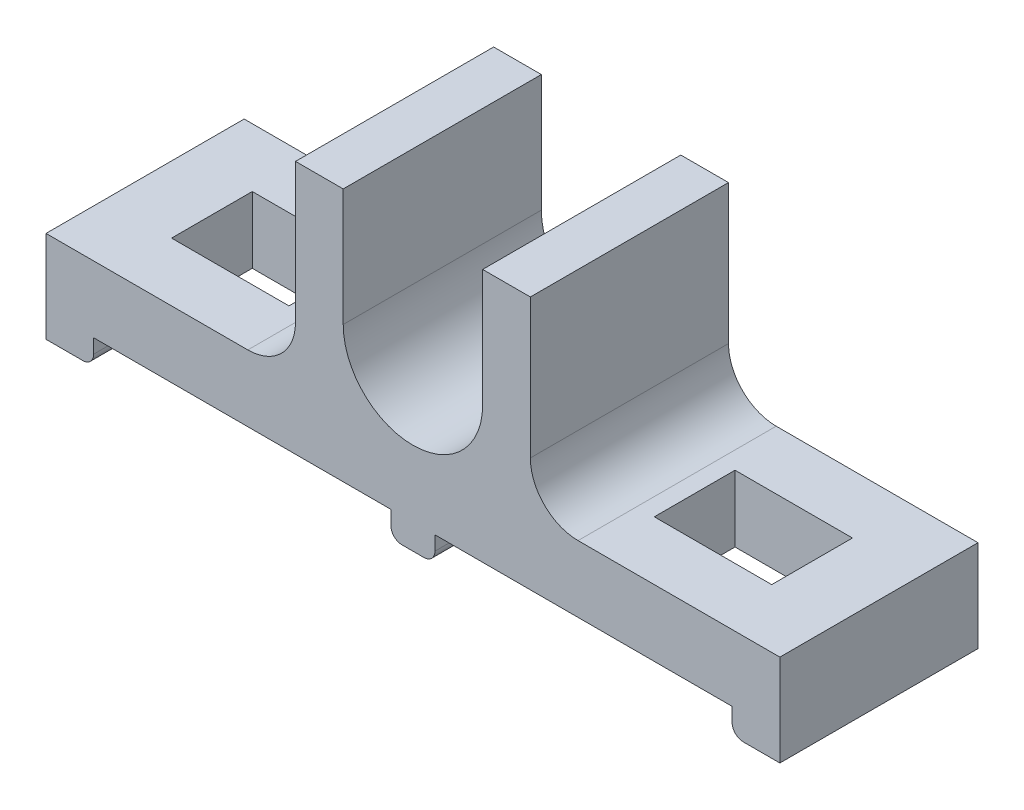
ISO-10303-21;
HEADER;
FILE_DESCRIPTION(('STEP AP214'),'2;1');
FILE_NAME('part.step','',(''),(''),'','','');
FILE_SCHEMA(('AUTOMOTIVE_DESIGN { 1 0 10303 214 1 1 1 1 }'));
ENDSEC;
DATA;
#1=APPLICATION_CONTEXT('core data for automotive mechanical design processes');
#2=APPLICATION_PROTOCOL_DEFINITION('international standard','automotive_design',2000,#1);
#3=PRODUCT_CONTEXT('',#1,'mechanical');
#4=PRODUCT('Part','Part','',(#3));
#5=PRODUCT_RELATED_PRODUCT_CATEGORY('part','',(#4));
#6=PRODUCT_DEFINITION_FORMATION('','',#4);
#7=PRODUCT_DEFINITION_CONTEXT('part definition',#1,'design');
#8=PRODUCT_DEFINITION('design','',#6,#7);
#9=PRODUCT_DEFINITION_SHAPE('','',#8);
#10=(LENGTH_UNIT() NAMED_UNIT(*) SI_UNIT(.MILLI.,.METRE.));
#11=(NAMED_UNIT(*) PLANE_ANGLE_UNIT() SI_UNIT($,.RADIAN.));
#12=(NAMED_UNIT(*) SI_UNIT($,.STERADIAN.) SOLID_ANGLE_UNIT());
#13=UNCERTAINTY_MEASURE_WITH_UNIT(LENGTH_MEASURE(1.E-05),#10,'distance_accuracy_value','');
#14=(GEOMETRIC_REPRESENTATION_CONTEXT(3) GLOBAL_UNCERTAINTY_ASSIGNED_CONTEXT((#13)) GLOBAL_UNIT_ASSIGNED_CONTEXT((#10,
#11,#12)) REPRESENTATION_CONTEXT('',''));
#15=CARTESIAN_POINT('',(0.,0.,0.));
#16=DIRECTION('',(0.,0.,1.));
#17=DIRECTION('',(1.,0.,0.));
#18=AXIS2_PLACEMENT_3D('',#15,#16,#17);
#19=CARTESIAN_POINT('',(187.,6.86757116341439,27.));
#20=DIRECTION('',(0.,1.,0.));
#21=DIRECTION('',(-1.,0.,0.));
#22=AXIS2_PLACEMENT_3D('',#19,#20,#21);
#23=PLANE('',#22);
#24=DIRECTION('',(1.,0.,0.));
#25=VECTOR('',#24,1.);
#26=CARTESIAN_POINT('',(187.,6.86757116341439,-27.));
#27=LINE('',#26,#25);
#28=CARTESIAN_POINT('',(106.,6.86757116341462,-27.));
#29=VERTEX_POINT('',#28);
#30=CARTESIAN_POINT('',(187.,6.86757116341439,-27.));
#31=VERTEX_POINT('',#30);
#32=EDGE_CURVE('E460',#29,#31,#27,.T.);
#33=ORIENTED_EDGE('',*,*,#32,.T.);
#34=DIRECTION('',(0.,0.,-1.));
#35=VECTOR('',#34,1.);
#36=CARTESIAN_POINT('',(187.,6.86757116341439,27.));
#37=LINE('',#36,#35);
#38=CARTESIAN_POINT('',(187.,6.86757116341439,27.));
#39=VERTEX_POINT('',#38);
#40=EDGE_CURVE('E566',#39,#31,#37,.T.);
#41=ORIENTED_EDGE('',*,*,#40,.F.);
#42=DIRECTION('',(1.,0.,0.));
#43=VECTOR('',#42,1.);
#44=CARTESIAN_POINT('',(187.,6.86757116341439,27.));
#45=LINE('',#44,#43);
#46=CARTESIAN_POINT('',(106.,6.86757116341462,27.));
#47=VERTEX_POINT('',#46);
#48=EDGE_CURVE('E381',#47,#39,#45,.T.);
#49=ORIENTED_EDGE('',*,*,#48,.F.);
#50=DIRECTION('',(0.,0.,-1.));
#51=VECTOR('',#50,1.);
#52=CARTESIAN_POINT('',(106.,6.86757116341462,27.));
#53=LINE('',#52,#51);
#54=EDGE_CURVE('E570',#47,#29,#53,.T.);
#55=ORIENTED_EDGE('',*,*,#54,.T.);
#56=EDGE_LOOP('',(#33,#41,#49,#55));
#57=FACE_BOUND('',#56,.T.);
#58=DIRECTION('',(0.,0.,1.));
#59=VECTOR('',#58,1.);
#60=CARTESIAN_POINT('',(181.781960671619,6.8675711634144,27.));
#61=LINE('',#60,#59);
#62=CARTESIAN_POINT('',(181.781960671619,6.86757116341445,-11.));
#63=VERTEX_POINT('',#62);
#64=CARTESIAN_POINT('',(181.781960671619,6.86757116341445,11.));
#65=VERTEX_POINT('',#64);
#66=EDGE_CURVE('E301',#63,#65,#61,.T.);
#67=ORIENTED_EDGE('',*,*,#66,.F.);
#68=DIRECTION('',(1.,0.,0.));
#69=VECTOR('',#68,1.);
#70=CARTESIAN_POINT('',(187.,6.86757116341439,-11.));
#71=LINE('',#70,#69);
#72=CARTESIAN_POINT('',(149.781960671618,6.8675711634145,-11.));
#73=VERTEX_POINT('',#72);
#74=EDGE_CURVE('E289',#73,#63,#71,.T.);
#75=ORIENTED_EDGE('',*,*,#74,.F.);
#76=DIRECTION('',(0.,0.,-1.));
#77=VECTOR('',#76,1.);
#78=CARTESIAN_POINT('',(149.781960671619,6.8675711634145,27.));
#79=LINE('',#78,#77);
#80=CARTESIAN_POINT('',(149.781960671619,6.86757116341449,11.));
#81=VERTEX_POINT('',#80);
#82=EDGE_CURVE('E264',#81,#73,#79,.T.);
#83=ORIENTED_EDGE('',*,*,#82,.F.);
#84=DIRECTION('',(-1.,0.,0.));
#85=VECTOR('',#84,1.);
#86=CARTESIAN_POINT('',(187.,6.86757116341439,11.));
#87=LINE('',#86,#85);
#88=EDGE_CURVE('E298',#65,#81,#87,.T.);
#89=ORIENTED_EDGE('',*,*,#88,.F.);
#90=EDGE_LOOP('',(#67,#75,#83,#89));
#91=FACE_BOUND('',#90,.T.);
#92=ADVANCED_FACE('F36',(#57,#91),#23,.F.);
#93=CARTESIAN_POINT('',(145.,24.9999999999999,27.));
#94=DIRECTION('',(0.,-1.,0.));
#95=DIRECTION('',(1.,0.,0.));
#96=AXIS2_PLACEMENT_3D('',#93,#94,#95);
#97=PLANE('',#96);
#98=DIRECTION('',(-1.,0.,0.));
#99=VECTOR('',#98,1.);
#100=CARTESIAN_POINT('',(145.,24.9999999999999,-27.));
#101=LINE('',#100,#99);
#102=CARTESIAN_POINT('',(200.,25.,-27.));
#103=VERTEX_POINT('',#102);
#104=CARTESIAN_POINT('',(145.,24.9999999999999,-27.));
#105=VERTEX_POINT('',#104);
#106=EDGE_CURVE('E475',#103,#105,#101,.T.);
#107=ORIENTED_EDGE('',*,*,#106,.T.);
#108=DIRECTION('',(0.,0.,-1.));
#109=VECTOR('',#108,1.);
#110=CARTESIAN_POINT('',(145.,24.9999999999999,27.));
#111=LINE('',#110,#109);
#112=CARTESIAN_POINT('',(145.,24.9999999999999,27.));
#113=VERTEX_POINT('',#112);
#114=EDGE_CURVE('E546',#113,#105,#111,.T.);
#115=ORIENTED_EDGE('',*,*,#114,.F.);
#116=DIRECTION('',(-1.,0.,0.));
#117=VECTOR('',#116,1.);
#118=CARTESIAN_POINT('',(145.,24.9999999999999,27.));
#119=LINE('',#118,#117);
#120=CARTESIAN_POINT('',(200.,25.,27.));
#121=VERTEX_POINT('',#120);
#122=EDGE_CURVE('E396',#121,#113,#119,.T.);
#123=ORIENTED_EDGE('',*,*,#122,.F.);
#124=DIRECTION('',(0.,0.,-1.));
#125=VECTOR('',#124,1.);
#126=CARTESIAN_POINT('',(200.,25.,27.));
#127=LINE('',#126,#125);
#128=EDGE_CURVE('E550',#121,#103,#127,.T.);
#129=ORIENTED_EDGE('',*,*,#128,.T.);
#130=EDGE_LOOP('',(#107,#115,#123,#129));
#131=FACE_BOUND('',#130,.T.);
#132=DIRECTION('',(0.,0.,1.));
#133=VECTOR('',#132,1.);
#134=CARTESIAN_POINT('',(181.781960671618,25.0000000000008,-11.));
#135=LINE('',#134,#133);
#136=CARTESIAN_POINT('',(181.781960671619,25.,-11.));
#137=VERTEX_POINT('',#136);
#138=CARTESIAN_POINT('',(181.781960671618,25.0000000000008,11.));
#139=VERTEX_POINT('',#138);
#140=EDGE_CURVE('E60',#137,#139,#135,.T.);
#141=ORIENTED_EDGE('',*,*,#140,.T.);
#142=DIRECTION('',(-1.,0.,0.));
#143=VECTOR('',#142,1.);
#144=CARTESIAN_POINT('',(181.781960671618,25.0000000000008,11.));
#145=LINE('',#144,#143);
#146=CARTESIAN_POINT('',(149.781960671618,25.0000000000005,11.));
#147=VERTEX_POINT('',#146);
#148=EDGE_CURVE('E278',#139,#147,#145,.T.);
#149=ORIENTED_EDGE('',*,*,#148,.T.);
#150=DIRECTION('',(0.,0.,-1.));
#151=VECTOR('',#150,1.);
#152=CARTESIAN_POINT('',(149.781960671618,25.0000000000005,-11.));
#153=LINE('',#152,#151);
#154=CARTESIAN_POINT('',(149.781960671618,25.0000000000005,-11.));
#155=VERTEX_POINT('',#154);
#156=EDGE_CURVE('E261',#147,#155,#153,.T.);
#157=ORIENTED_EDGE('',*,*,#156,.T.);
#158=DIRECTION('',(1.,0.,0.));
#159=VECTOR('',#158,1.);
#160=CARTESIAN_POINT('',(181.781960671618,25.0000000000008,-11.));
#161=LINE('',#160,#159);
#162=EDGE_CURVE('E271',#155,#137,#161,.T.);
#163=ORIENTED_EDGE('',*,*,#162,.T.);
#164=EDGE_LOOP('',(#141,#149,#157,#163));
#165=FACE_BOUND('',#164,.T.);
#166=ADVANCED_FACE('F276',(#131,#165),#97,.F.);
#167=CARTESIAN_POINT('',(0.,0.,27.));
#168=DIRECTION('',(1.,0.,0.));
#169=DIRECTION('',(0.,0.,-1.));
#170=AXIS2_PLACEMENT_3D('',#167,#168,#169);
#171=PLANE('',#170);
#172=DIRECTION('',(0.,-1.,0.));
#173=VECTOR('',#172,1.);
#174=CARTESIAN_POINT('',(0.,0.,-27.));
#175=LINE('',#174,#173);
#176=CARTESIAN_POINT('',(0.,25.,-27.));
#177=VERTEX_POINT('',#176);
#178=CARTESIAN_POINT('',(0.,0.,-27.));
#179=VERTEX_POINT('',#178);
#180=EDGE_CURVE('E348',#177,#179,#175,.T.);
#181=ORIENTED_EDGE('',*,*,#180,.T.);
#182=DIRECTION('',(0.,0.,-1.));
#183=VECTOR('',#182,1.);
#184=CARTESIAN_POINT('',(0.,0.,27.));
#185=LINE('',#184,#183);
#186=CARTESIAN_POINT('',(0.,0.,27.));
#187=VERTEX_POINT('',#186);
#188=EDGE_CURVE('E11',#187,#179,#185,.T.);
#189=ORIENTED_EDGE('',*,*,#188,.F.);
#190=DIRECTION('',(0.,-1.,0.));
#191=VECTOR('',#190,1.);
#192=CARTESIAN_POINT('',(0.,0.,27.));
#193=LINE('',#192,#191);
#194=CARTESIAN_POINT('',(0.,25.,27.));
#195=VERTEX_POINT('',#194);
#196=EDGE_CURVE('E349',#195,#187,#193,.T.);
#197=ORIENTED_EDGE('',*,*,#196,.F.);
#198=DIRECTION('',(0.,0.,-1.));
#199=VECTOR('',#198,1.);
#200=CARTESIAN_POINT('',(0.,25.,27.));
#201=LINE('',#200,#199);
#202=EDGE_CURVE('E429',#195,#177,#201,.T.);
#203=ORIENTED_EDGE('',*,*,#202,.T.);
#204=EDGE_LOOP('',(#181,#189,#197,#203));
#205=FACE_BOUND('',#204,.T.);
#206=ADVANCED_FACE('F38',(#205),#171,.F.);
#207=CARTESIAN_POINT('',(0.,0.,27.));
#208=DIRECTION('',(0.,1.,0.));
#209=DIRECTION('',(0.,0.,1.));
#210=AXIS2_PLACEMENT_3D('',#207,#208,#209);
#211=PLANE('',#210);
#212=DIRECTION('',(1.,0.,0.));
#213=VECTOR('',#212,1.);
#214=CARTESIAN_POINT('',(0.,0.,-27.));
#215=LINE('',#214,#213);
#216=CARTESIAN_POINT('',(10.,0.,-27.));
#217=VERTEX_POINT('',#216);
#218=EDGE_CURVE('E433',#179,#217,#215,.T.);
#219=ORIENTED_EDGE('',*,*,#218,.T.);
#220=DIRECTION('',(0.,0.,-1.));
#221=VECTOR('',#220,1.);
#222=CARTESIAN_POINT('',(10.,0.,27.));
#223=LINE('',#222,#221);
#224=CARTESIAN_POINT('',(10.,0.,27.));
#225=VERTEX_POINT('',#224);
#226=EDGE_CURVE('E45',#225,#217,#223,.T.);
#227=ORIENTED_EDGE('',*,*,#226,.F.);
#228=DIRECTION('',(1.,0.,0.));
#229=VECTOR('',#228,1.);
#230=CARTESIAN_POINT('',(0.,0.,27.));
#231=LINE('',#230,#229);
#232=EDGE_CURVE('E353',#187,#225,#231,.T.);
#233=ORIENTED_EDGE('',*,*,#232,.F.);
#234=ORIENTED_EDGE('',*,*,#188,.T.);
#235=EDGE_LOOP('',(#219,#227,#233,#234));
#236=FACE_BOUND('',#235,.T.);
#237=ADVANCED_FACE('F631',(#236),#211,.F.);
#238=CARTESIAN_POINT('',(10.,3.,27.));
#239=DIRECTION('',(0.,0.,-1.));
#240=DIRECTION('',(-1.,0.,0.));
#241=AXIS2_PLACEMENT_3D('',#238,#239,#240);
#242=CYLINDRICAL_SURFACE('',#241,3.);
#243=CARTESIAN_POINT('',(10.,3.,-27.));
#244=DIRECTION('',(0.,0.,1.));
#245=DIRECTION('',(-1.,0.,0.));
#246=AXIS2_PLACEMENT_3D('',#243,#244,#245);
#247=CIRCLE('',#246,3.);
#248=CARTESIAN_POINT('',(13.,3.,-27.));
#249=VERTEX_POINT('',#248);
#250=EDGE_CURVE('E436',#217,#249,#247,.T.);
#251=ORIENTED_EDGE('',*,*,#250,.T.);
#252=DIRECTION('',(0.,0.,-1.));
#253=VECTOR('',#252,1.);
#254=CARTESIAN_POINT('',(13.,3.,27.));
#255=LINE('',#254,#253);
#256=CARTESIAN_POINT('',(13.,3.,27.));
#257=VERTEX_POINT('',#256);
#258=EDGE_CURVE('E598',#257,#249,#255,.T.);
#259=ORIENTED_EDGE('',*,*,#258,.F.);
#260=CARTESIAN_POINT('',(10.,3.,27.));
#261=DIRECTION('',(0.,0.,1.));
#262=DIRECTION('',(-1.,0.,0.));
#263=AXIS2_PLACEMENT_3D('',#260,#261,#262);
#264=CIRCLE('',#263,3.);
#265=EDGE_CURVE('E357',#225,#257,#264,.T.);
#266=ORIENTED_EDGE('',*,*,#265,.F.);
#267=ORIENTED_EDGE('',*,*,#226,.T.);
#268=EDGE_LOOP('',(#251,#259,#266,#267));
#269=FACE_BOUND('',#268,.T.);
#270=ADVANCED_FACE('F608',(#269),#242,.T.);
#271=CARTESIAN_POINT('',(13.,3.,27.));
#272=DIRECTION('',(-1.,0.,0.));
#273=DIRECTION('',(0.,0.,1.));
#274=AXIS2_PLACEMENT_3D('',#271,#272,#273);
#275=PLANE('',#274);
#276=DIRECTION('',(0.,1.,0.));
#277=VECTOR('',#276,1.);
#278=CARTESIAN_POINT('',(13.,3.,-27.));
#279=LINE('',#278,#277);
#280=CARTESIAN_POINT('',(13.,6.86757116341463,-27.));
#281=VERTEX_POINT('',#280);
#282=EDGE_CURVE('E439',#249,#281,#279,.T.);
#283=ORIENTED_EDGE('',*,*,#282,.T.);
#284=DIRECTION('',(0.,0.,-1.));
#285=VECTOR('',#284,1.);
#286=CARTESIAN_POINT('',(13.,6.86757116341463,27.));
#287=LINE('',#286,#285);
#288=CARTESIAN_POINT('',(13.,6.86757116341463,27.));
#289=VERTEX_POINT('',#288);
#290=EDGE_CURVE('E594',#289,#281,#287,.T.);
#291=ORIENTED_EDGE('',*,*,#290,.F.);
#292=DIRECTION('',(0.,1.,0.));
#293=VECTOR('',#292,1.);
#294=CARTESIAN_POINT('',(13.,3.,27.));
#295=LINE('',#294,#293);
#296=EDGE_CURVE('E360',#257,#289,#295,.T.);
#297=ORIENTED_EDGE('',*,*,#296,.F.);
#298=ORIENTED_EDGE('',*,*,#258,.T.);
#299=EDGE_LOOP('',(#283,#291,#297,#298));
#300=FACE_BOUND('',#299,.T.);
#301=ADVANCED_FACE('F619',(#300),#275,.F.);
#302=CARTESIAN_POINT('',(13.,6.86757116341463,27.));
#303=DIRECTION('',(0.,1.,0.));
#304=DIRECTION('',(-1.,0.,0.));
#305=AXIS2_PLACEMENT_3D('',#302,#303,#304);
#306=PLANE('',#305);
#307=DIRECTION('',(-1.,0.,0.));
#308=VECTOR('',#307,1.);
#309=CARTESIAN_POINT('',(13.,6.86757116341463,-11.));
#310=LINE('',#309,#308);
#311=CARTESIAN_POINT('',(50.2180393283821,6.86757116341463,-11.));
#312=VERTEX_POINT('',#311);
#313=CARTESIAN_POINT('',(18.2180393283821,6.86757116341463,-11.));
#314=VERTEX_POINT('',#313);
#315=EDGE_CURVE('E340',#312,#314,#310,.T.);
#316=ORIENTED_EDGE('',*,*,#315,.T.);
#317=DIRECTION('',(0.,0.,1.));
#318=VECTOR('',#317,1.);
#319=CARTESIAN_POINT('',(18.2180393283821,6.86757116341463,27.));
#320=LINE('',#319,#318);
#321=CARTESIAN_POINT('',(18.2180393283821,6.86757116341463,11.));
#322=VERTEX_POINT('',#321);
#323=EDGE_CURVE('E344',#314,#322,#320,.T.);
#324=ORIENTED_EDGE('',*,*,#323,.T.);
#325=DIRECTION('',(1.,0.,0.));
#326=VECTOR('',#325,1.);
#327=CARTESIAN_POINT('',(13.,6.86757116341463,11.));
#328=LINE('',#327,#326);
#329=CARTESIAN_POINT('',(50.2180393283821,6.86757116341463,11.));
#330=VERTEX_POINT('',#329);
#331=EDGE_CURVE('E323',#322,#330,#328,.T.);
#332=ORIENTED_EDGE('',*,*,#331,.T.);
#333=DIRECTION('',(0.,0.,-1.));
#334=VECTOR('',#333,1.);
#335=CARTESIAN_POINT('',(50.2180393283821,6.86757116341463,27.));
#336=LINE('',#335,#334);
#337=EDGE_CURVE('E336',#330,#312,#336,.T.);
#338=ORIENTED_EDGE('',*,*,#337,.T.);
#339=EDGE_LOOP('',(#316,#324,#332,#338));
#340=FACE_BOUND('',#339,.T.);
#341=DIRECTION('',(1.,0.,0.));
#342=VECTOR('',#341,1.);
#343=CARTESIAN_POINT('',(13.,6.86757116341463,-27.));
#344=LINE('',#343,#342);
#345=CARTESIAN_POINT('',(94.,6.86757116341463,-27.));
#346=VERTEX_POINT('',#345);
#347=EDGE_CURVE('E442',#281,#346,#344,.T.);
#348=ORIENTED_EDGE('',*,*,#347,.T.);
#349=DIRECTION('',(0.,0.,-1.));
#350=VECTOR('',#349,1.);
#351=CARTESIAN_POINT('',(94.,6.86757116341463,27.));
#352=LINE('',#351,#350);
#353=CARTESIAN_POINT('',(94.,6.86757116341463,27.));
#354=VERTEX_POINT('',#353);
#355=EDGE_CURVE('E590',#354,#346,#352,.T.);
#356=ORIENTED_EDGE('',*,*,#355,.F.);
#357=DIRECTION('',(1.,0.,0.));
#358=VECTOR('',#357,1.);
#359=CARTESIAN_POINT('',(13.,6.86757116341463,27.));
#360=LINE('',#359,#358);
#361=EDGE_CURVE('E363',#289,#354,#360,.T.);
#362=ORIENTED_EDGE('',*,*,#361,.F.);
#363=ORIENTED_EDGE('',*,*,#290,.T.);
#364=EDGE_LOOP('',(#348,#356,#362,#363));
#365=FACE_BOUND('',#364,.T.);
#366=ADVANCED_FACE('F623',(#340,#365),#306,.F.);
#367=CARTESIAN_POINT('',(94.,3.,27.));
#368=DIRECTION('',(1.,0.,0.));
#369=DIRECTION('',(0.,0.,-1.));
#370=AXIS2_PLACEMENT_3D('',#367,#368,#369);
#371=PLANE('',#370);
#372=DIRECTION('',(0.,-1.,0.));
#373=VECTOR('',#372,1.);
#374=CARTESIAN_POINT('',(94.,3.,-27.));
#375=LINE('',#374,#373);
#376=CARTESIAN_POINT('',(94.,3.,-27.));
#377=VERTEX_POINT('',#376);
#378=EDGE_CURVE('E445',#346,#377,#375,.T.);
#379=ORIENTED_EDGE('',*,*,#378,.T.);
#380=DIRECTION('',(0.,0.,-1.));
#381=VECTOR('',#380,1.);
#382=CARTESIAN_POINT('',(94.,3.,27.));
#383=LINE('',#382,#381);
#384=CARTESIAN_POINT('',(94.,3.,27.));
#385=VERTEX_POINT('',#384);
#386=EDGE_CURVE('E586',#385,#377,#383,.T.);
#387=ORIENTED_EDGE('',*,*,#386,.F.);
#388=DIRECTION('',(0.,-1.,0.));
#389=VECTOR('',#388,1.);
#390=CARTESIAN_POINT('',(94.,3.,27.));
#391=LINE('',#390,#389);
#392=EDGE_CURVE('E366',#354,#385,#391,.T.);
#393=ORIENTED_EDGE('',*,*,#392,.F.);
#394=ORIENTED_EDGE('',*,*,#355,.T.);
#395=EDGE_LOOP('',(#379,#387,#393,#394));
#396=FACE_BOUND('',#395,.T.);
#397=ADVANCED_FACE('F733',(#396),#371,.F.);
#398=CARTESIAN_POINT('',(97.,3.,27.));
#399=DIRECTION('',(0.,0.,-1.));
#400=DIRECTION('',(-1.,0.,0.));
#401=AXIS2_PLACEMENT_3D('',#398,#399,#400);
#402=CYLINDRICAL_SURFACE('',#401,3.00000000000001);
#403=CARTESIAN_POINT('',(97.,3.,-27.));
#404=DIRECTION('',(0.,0.,1.));
#405=DIRECTION('',(1.,0.,0.));
#406=AXIS2_PLACEMENT_3D('',#403,#404,#405);
#407=CIRCLE('',#406,3.00000000000001);
#408=CARTESIAN_POINT('',(97.,0.,-27.));
#409=VERTEX_POINT('',#408);
#410=EDGE_CURVE('E448',#377,#409,#407,.T.);
#411=ORIENTED_EDGE('',*,*,#410,.T.);
#412=DIRECTION('',(0.,0.,-1.));
#413=VECTOR('',#412,1.);
#414=CARTESIAN_POINT('',(97.,0.,27.));
#415=LINE('',#414,#413);
#416=CARTESIAN_POINT('',(97.,0.,27.));
#417=VERTEX_POINT('',#416);
#418=EDGE_CURVE('E582',#417,#409,#415,.T.);
#419=ORIENTED_EDGE('',*,*,#418,.F.);
#420=CARTESIAN_POINT('',(97.,3.,27.));
#421=DIRECTION('',(0.,0.,1.));
#422=DIRECTION('',(1.,0.,0.));
#423=AXIS2_PLACEMENT_3D('',#420,#421,#422);
#424=CIRCLE('',#423,3.00000000000001);
#425=EDGE_CURVE('E369',#385,#417,#424,.T.);
#426=ORIENTED_EDGE('',*,*,#425,.F.);
#427=ORIENTED_EDGE('',*,*,#386,.T.);
#428=EDGE_LOOP('',(#411,#419,#426,#427));
#429=FACE_BOUND('',#428,.T.);
#430=ADVANCED_FACE('F731',(#429),#402,.T.);
#431=CARTESIAN_POINT('',(97.,0.,27.));
#432=DIRECTION('',(0.,1.,0.));
#433=DIRECTION('',(-1.,0.,0.));
#434=AXIS2_PLACEMENT_3D('',#431,#432,#433);
#435=PLANE('',#434);
#436=DIRECTION('',(1.,0.,0.));
#437=VECTOR('',#436,1.);
#438=CARTESIAN_POINT('',(97.,0.,-27.));
#439=LINE('',#438,#437);
#440=CARTESIAN_POINT('',(103.,0.,-27.));
#441=VERTEX_POINT('',#440);
#442=EDGE_CURVE('E451',#409,#441,#439,.T.);
#443=ORIENTED_EDGE('',*,*,#442,.T.);
#444=DIRECTION('',(0.,0.,-1.));
#445=VECTOR('',#444,1.);
#446=CARTESIAN_POINT('',(103.,0.,27.));
#447=LINE('',#446,#445);
#448=CARTESIAN_POINT('',(103.,0.,27.));
#449=VERTEX_POINT('',#448);
#450=EDGE_CURVE('E578',#449,#441,#447,.T.);
#451=ORIENTED_EDGE('',*,*,#450,.F.);
#452=DIRECTION('',(1.,0.,0.));
#453=VECTOR('',#452,1.);
#454=CARTESIAN_POINT('',(97.,0.,27.));
#455=LINE('',#454,#453);
#456=EDGE_CURVE('E372',#417,#449,#455,.T.);
#457=ORIENTED_EDGE('',*,*,#456,.F.);
#458=ORIENTED_EDGE('',*,*,#418,.T.);
#459=EDGE_LOOP('',(#443,#451,#457,#458));
#460=FACE_BOUND('',#459,.T.);
#461=ADVANCED_FACE('F726',(#460),#435,.F.);
#462=CARTESIAN_POINT('',(103.,2.99999999999999,27.));
#463=DIRECTION('',(0.,0.,-1.));
#464=DIRECTION('',(-1.,0.,0.));
#465=AXIS2_PLACEMENT_3D('',#462,#463,#464);
#466=CYLINDRICAL_SURFACE('',#465,3.00000000000001);
#467=CARTESIAN_POINT('',(103.,2.99999999999999,-27.));
#468=DIRECTION('',(0.,0.,1.));
#469=DIRECTION('',(-1.,0.,0.));
#470=AXIS2_PLACEMENT_3D('',#467,#468,#469);
#471=CIRCLE('',#470,3.00000000000001);
#472=CARTESIAN_POINT('',(106.,2.99999999999999,-27.));
#473=VERTEX_POINT('',#472);
#474=EDGE_CURVE('E454',#441,#473,#471,.T.);
#475=ORIENTED_EDGE('',*,*,#474,.T.);
#476=DIRECTION('',(0.,0.,-1.));
#477=VECTOR('',#476,1.);
#478=CARTESIAN_POINT('',(106.,2.99999999999999,27.));
#479=LINE('',#478,#477);
#480=CARTESIAN_POINT('',(106.,2.99999999999999,27.));
#481=VERTEX_POINT('',#480);
#482=EDGE_CURVE('E574',#481,#473,#479,.T.);
#483=ORIENTED_EDGE('',*,*,#482,.F.);
#484=CARTESIAN_POINT('',(103.,2.99999999999999,27.));
#485=DIRECTION('',(0.,0.,1.));
#486=DIRECTION('',(-1.,0.,0.));
#487=AXIS2_PLACEMENT_3D('',#484,#485,#486);
#488=CIRCLE('',#487,3.00000000000001);
#489=EDGE_CURVE('E375',#449,#481,#488,.T.);
#490=ORIENTED_EDGE('',*,*,#489,.F.);
#491=ORIENTED_EDGE('',*,*,#450,.T.);
#492=EDGE_LOOP('',(#475,#483,#490,#491));
#493=FACE_BOUND('',#492,.T.);
#494=ADVANCED_FACE('F721',(#493),#466,.T.);
#495=CARTESIAN_POINT('',(106.,2.99999999999999,27.));
#496=DIRECTION('',(-1.,0.,0.));
#497=DIRECTION('',(0.,0.,1.));
#498=AXIS2_PLACEMENT_3D('',#495,#496,#497);
#499=PLANE('',#498);
#500=DIRECTION('',(0.,1.,0.));
#501=VECTOR('',#500,1.);
#502=CARTESIAN_POINT('',(106.,2.99999999999999,-27.));
#503=LINE('',#502,#501);
#504=EDGE_CURVE('E457',#473,#29,#503,.T.);
#505=ORIENTED_EDGE('',*,*,#504,.T.);
#506=ORIENTED_EDGE('',*,*,#54,.F.);
#507=DIRECTION('',(0.,1.,0.));
#508=VECTOR('',#507,1.);
#509=CARTESIAN_POINT('',(106.,2.99999999999999,27.));
#510=LINE('',#509,#508);
#511=EDGE_CURVE('E378',#481,#47,#510,.T.);
#512=ORIENTED_EDGE('',*,*,#511,.F.);
#513=ORIENTED_EDGE('',*,*,#482,.T.);
#514=EDGE_LOOP('',(#505,#506,#512,#513));
#515=FACE_BOUND('',#514,.T.);
#516=ADVANCED_FACE('F717',(#515),#499,.F.);
#517=CARTESIAN_POINT('',(187.,2.99999999999976,27.));
#518=DIRECTION('',(1.,0.,0.));
#519=DIRECTION('',(0.,0.,-1.));
#520=AXIS2_PLACEMENT_3D('',#517,#518,#519);
#521=PLANE('',#520);
#522=DIRECTION('',(0.,-1.,0.));
#523=VECTOR('',#522,1.);
#524=CARTESIAN_POINT('',(187.,2.99999999999976,-27.));
#525=LINE('',#524,#523);
#526=CARTESIAN_POINT('',(187.,2.99999999999976,-27.));
#527=VERTEX_POINT('',#526);
#528=EDGE_CURVE('E463',#31,#527,#525,.T.);
#529=ORIENTED_EDGE('',*,*,#528,.T.);
#530=DIRECTION('',(0.,0.,-1.));
#531=VECTOR('',#530,1.);
#532=CARTESIAN_POINT('',(187.,2.99999999999976,27.));
#533=LINE('',#532,#531);
#534=CARTESIAN_POINT('',(187.,2.99999999999976,27.));
#535=VERTEX_POINT('',#534);
#536=EDGE_CURVE('E562',#535,#527,#533,.T.);
#537=ORIENTED_EDGE('',*,*,#536,.F.);
#538=DIRECTION('',(0.,-1.,0.));
#539=VECTOR('',#538,1.);
#540=CARTESIAN_POINT('',(187.,2.99999999999976,27.));
#541=LINE('',#540,#539);
#542=EDGE_CURVE('E384',#39,#535,#541,.T.);
#543=ORIENTED_EDGE('',*,*,#542,.F.);
#544=ORIENTED_EDGE('',*,*,#40,.T.);
#545=EDGE_LOOP('',(#529,#537,#543,#544));
#546=FACE_BOUND('',#545,.T.);
#547=ADVANCED_FACE('F706',(#546),#521,.F.);
#548=CARTESIAN_POINT('',(190.,2.99999999999975,27.));
#549=DIRECTION('',(0.,0.,-1.));
#550=DIRECTION('',(-1.,0.,0.));
#551=AXIS2_PLACEMENT_3D('',#548,#549,#550);
#552=CYLINDRICAL_SURFACE('',#551,3.);
#553=CARTESIAN_POINT('',(190.,2.99999999999975,-27.));
#554=DIRECTION('',(0.,0.,1.));
#555=DIRECTION('',(1.,0.,0.));
#556=AXIS2_PLACEMENT_3D('',#553,#554,#555);
#557=CIRCLE('',#556,3.);
#558=CARTESIAN_POINT('',(190.,-2.51101223147643E-13,-27.));
#559=VERTEX_POINT('',#558);
#560=EDGE_CURVE('E466',#527,#559,#557,.T.);
#561=ORIENTED_EDGE('',*,*,#560,.T.);
#562=DIRECTION('',(0.,0.,-1.));
#563=VECTOR('',#562,1.);
#564=CARTESIAN_POINT('',(190.,-2.51101223147643E-13,27.));
#565=LINE('',#564,#563);
#566=CARTESIAN_POINT('',(190.,-2.51101223147643E-13,27.));
#567=VERTEX_POINT('',#566);
#568=EDGE_CURVE('E558',#567,#559,#565,.T.);
#569=ORIENTED_EDGE('',*,*,#568,.F.);
#570=CARTESIAN_POINT('',(190.,2.99999999999975,27.));
#571=DIRECTION('',(0.,0.,1.));
#572=DIRECTION('',(1.,0.,0.));
#573=AXIS2_PLACEMENT_3D('',#570,#571,#572);
#574=CIRCLE('',#573,3.);
#575=EDGE_CURVE('E387',#535,#567,#574,.T.);
#576=ORIENTED_EDGE('',*,*,#575,.F.);
#577=ORIENTED_EDGE('',*,*,#536,.T.);
#578=EDGE_LOOP('',(#561,#569,#576,#577));
#579=FACE_BOUND('',#578,.T.);
#580=ADVANCED_FACE('F702',(#579),#552,.T.);
#581=CARTESIAN_POINT('',(190.,-2.4980018054066E-13,27.));
#582=DIRECTION('',(0.,1.,0.));
#583=DIRECTION('',(-1.,0.,0.));
#584=AXIS2_PLACEMENT_3D('',#581,#582,#583);
#585=PLANE('',#584);
#586=DIRECTION('',(1.,0.,0.));
#587=VECTOR('',#586,1.);
#588=CARTESIAN_POINT('',(190.,-2.4980018054066E-13,-27.));
#589=LINE('',#588,#587);
#590=CARTESIAN_POINT('',(200.,0.,-27.));
#591=VERTEX_POINT('',#590);
#592=EDGE_CURVE('E469',#559,#591,#589,.T.);
#593=ORIENTED_EDGE('',*,*,#592,.T.);
#594=DIRECTION('',(0.,0.,-1.));
#595=VECTOR('',#594,1.);
#596=CARTESIAN_POINT('',(200.,0.,27.));
#597=LINE('',#596,#595);
#598=CARTESIAN_POINT('',(200.,0.,27.));
#599=VERTEX_POINT('',#598);
#600=EDGE_CURVE('E554',#599,#591,#597,.T.);
#601=ORIENTED_EDGE('',*,*,#600,.F.);
#602=DIRECTION('',(1.,0.,0.));
#603=VECTOR('',#602,1.);
#604=CARTESIAN_POINT('',(190.,-2.4980018054066E-13,27.));
#605=LINE('',#604,#603);
#606=EDGE_CURVE('E390',#567,#599,#605,.T.);
#607=ORIENTED_EDGE('',*,*,#606,.F.);
#608=ORIENTED_EDGE('',*,*,#568,.T.);
#609=EDGE_LOOP('',(#593,#601,#607,#608));
#610=FACE_BOUND('',#609,.T.);
#611=ADVANCED_FACE('F697',(#610),#585,.F.);
#612=CARTESIAN_POINT('',(200.,0.,27.));
#613=DIRECTION('',(-1.,0.,0.));
#614=DIRECTION('',(0.,0.,1.));
#615=AXIS2_PLACEMENT_3D('',#612,#613,#614);
#616=PLANE('',#615);
#617=DIRECTION('',(0.,1.,0.));
#618=VECTOR('',#617,1.);
#619=CARTESIAN_POINT('',(200.,0.,-27.));
#620=LINE('',#619,#618);
#621=EDGE_CURVE('E472',#591,#103,#620,.T.);
#622=ORIENTED_EDGE('',*,*,#621,.T.);
#623=ORIENTED_EDGE('',*,*,#128,.F.);
#624=DIRECTION('',(0.,1.,0.));
#625=VECTOR('',#624,1.);
#626=CARTESIAN_POINT('',(200.,0.,27.));
#627=LINE('',#626,#625);
#628=EDGE_CURVE('E393',#599,#121,#627,.T.);
#629=ORIENTED_EDGE('',*,*,#628,.F.);
#630=ORIENTED_EDGE('',*,*,#600,.T.);
#631=EDGE_LOOP('',(#622,#623,#629,#630));
#632=FACE_BOUND('',#631,.T.);
#633=ADVANCED_FACE('F691',(#632),#616,.F.);
#634=CARTESIAN_POINT('',(145.,37.9999999999999,27.));
#635=DIRECTION('',(0.,0.,-1.));
#636=DIRECTION('',(-1.,0.,0.));
#637=AXIS2_PLACEMENT_3D('',#634,#635,#636);
#638=CYLINDRICAL_SURFACE('',#637,13.);
#639=CARTESIAN_POINT('',(145.,37.9999999999999,-27.));
#640=DIRECTION('',(0.,0.,-1.));
#641=DIRECTION('',(1.,0.,0.));
#642=AXIS2_PLACEMENT_3D('',#639,#640,#641);
#643=CIRCLE('',#642,13.);
#644=CARTESIAN_POINT('',(132.,38.,-27.));
#645=VERTEX_POINT('',#644);
#646=EDGE_CURVE('E478',#105,#645,#643,.T.);
#647=ORIENTED_EDGE('',*,*,#646,.T.);
#648=DIRECTION('',(0.,0.,-1.));
#649=VECTOR('',#648,1.);
#650=CARTESIAN_POINT('',(132.,38.,27.));
#651=LINE('',#650,#649);
#652=CARTESIAN_POINT('',(132.,38.,27.));
#653=VERTEX_POINT('',#652);
#654=EDGE_CURVE('E542',#653,#645,#651,.T.);
#655=ORIENTED_EDGE('',*,*,#654,.F.);
#656=CARTESIAN_POINT('',(145.,37.9999999999999,27.));
#657=DIRECTION('',(0.,0.,-1.));
#658=DIRECTION('',(1.,0.,0.));
#659=AXIS2_PLACEMENT_3D('',#656,#657,#658);
#660=CIRCLE('',#659,13.);
#661=EDGE_CURVE('E399',#113,#653,#660,.T.);
#662=ORIENTED_EDGE('',*,*,#661,.F.);
#663=ORIENTED_EDGE('',*,*,#114,.T.);
#664=EDGE_LOOP('',(#647,#655,#662,#663));
#665=FACE_BOUND('',#664,.T.);
#666=ADVANCED_FACE('F683',(#665),#638,.F.);
#667=CARTESIAN_POINT('',(132.,38.,27.));
#668=DIRECTION('',(-1.,0.,0.));
#669=DIRECTION('',(0.,-1.,0.));
#670=AXIS2_PLACEMENT_3D('',#667,#668,#669);
#671=PLANE('',#670);
#672=DIRECTION('',(0.,1.,0.));
#673=VECTOR('',#672,1.);
#674=CARTESIAN_POINT('',(132.,38.,-27.));
#675=LINE('',#674,#673);
#676=CARTESIAN_POINT('',(132.,76.,-27.));
#677=VERTEX_POINT('',#676);
#678=EDGE_CURVE('E481',#645,#677,#675,.T.);
#679=ORIENTED_EDGE('',*,*,#678,.T.);
#680=DIRECTION('',(0.,0.,-1.));
#681=VECTOR('',#680,1.);
#682=CARTESIAN_POINT('',(132.,76.,27.));
#683=LINE('',#682,#681);
#684=CARTESIAN_POINT('',(132.,76.,27.));
#685=VERTEX_POINT('',#684);
#686=EDGE_CURVE('E538',#685,#677,#683,.T.);
#687=ORIENTED_EDGE('',*,*,#686,.F.);
#688=DIRECTION('',(0.,1.,0.));
#689=VECTOR('',#688,1.);
#690=CARTESIAN_POINT('',(132.,38.,27.));
#691=LINE('',#690,#689);
#692=EDGE_CURVE('E402',#653,#685,#691,.T.);
#693=ORIENTED_EDGE('',*,*,#692,.F.);
#694=ORIENTED_EDGE('',*,*,#654,.T.);
#695=EDGE_LOOP('',(#679,#687,#693,#694));
#696=FACE_BOUND('',#695,.T.);
#697=ADVANCED_FACE('F677',(#696),#671,.F.);
#698=CARTESIAN_POINT('',(119.,76.,27.));
#699=DIRECTION('',(0.,-1.,0.));
#700=DIRECTION('',(0.,0.,-1.));
#701=AXIS2_PLACEMENT_3D('',#698,#699,#700);
#702=PLANE('',#701);
#703=DIRECTION('',(-1.,0.,0.));
#704=VECTOR('',#703,1.);
#705=CARTESIAN_POINT('',(119.,76.,-27.));
#706=LINE('',#705,#704);
#707=CARTESIAN_POINT('',(119.,76.,-27.));
#708=VERTEX_POINT('',#707);
#709=EDGE_CURVE('E484',#677,#708,#706,.T.);
#710=ORIENTED_EDGE('',*,*,#709,.T.);
#711=DIRECTION('',(0.,0.,-1.));
#712=VECTOR('',#711,1.);
#713=CARTESIAN_POINT('',(119.,76.,27.));
#714=LINE('',#713,#712);
#715=CARTESIAN_POINT('',(119.,76.,27.));
#716=VERTEX_POINT('',#715);
#717=EDGE_CURVE('E534',#716,#708,#714,.T.);
#718=ORIENTED_EDGE('',*,*,#717,.F.);
#719=DIRECTION('',(-1.,0.,0.));
#720=VECTOR('',#719,1.);
#721=CARTESIAN_POINT('',(119.,76.,27.));
#722=LINE('',#721,#720);
#723=EDGE_CURVE('E405',#685,#716,#722,.T.);
#724=ORIENTED_EDGE('',*,*,#723,.F.);
#725=ORIENTED_EDGE('',*,*,#686,.T.);
#726=EDGE_LOOP('',(#710,#718,#724,#725));
#727=FACE_BOUND('',#726,.T.);
#728=ADVANCED_FACE('F673',(#727),#702,.F.);
#729=CARTESIAN_POINT('',(119.,44.0000000000001,27.));
#730=DIRECTION('',(1.,0.,0.));
#731=DIRECTION('',(0.,1.,0.));
#732=AXIS2_PLACEMENT_3D('',#729,#730,#731);
#733=PLANE('',#732);
#734=DIRECTION('',(0.,-1.,0.));
#735=VECTOR('',#734,1.);
#736=CARTESIAN_POINT('',(119.,44.0000000000001,-27.));
#737=LINE('',#736,#735);
#738=CARTESIAN_POINT('',(119.,44.0000000000001,-27.));
#739=VERTEX_POINT('',#738);
#740=EDGE_CURVE('E487',#708,#739,#737,.T.);
#741=ORIENTED_EDGE('',*,*,#740,.T.);
#742=DIRECTION('',(0.,0.,-1.));
#743=VECTOR('',#742,1.);
#744=CARTESIAN_POINT('',(119.,44.0000000000001,27.));
#745=LINE('',#744,#743);
#746=CARTESIAN_POINT('',(119.,44.0000000000001,27.));
#747=VERTEX_POINT('',#746);
#748=EDGE_CURVE('E530',#747,#739,#745,.T.);
#749=ORIENTED_EDGE('',*,*,#748,.F.);
#750=DIRECTION('',(0.,-1.,0.));
#751=VECTOR('',#750,1.);
#752=CARTESIAN_POINT('',(119.,44.0000000000001,27.));
#753=LINE('',#752,#751);
#754=EDGE_CURVE('E408',#716,#747,#753,.T.);
#755=ORIENTED_EDGE('',*,*,#754,.F.);
#756=ORIENTED_EDGE('',*,*,#717,.T.);
#757=EDGE_LOOP('',(#741,#749,#755,#756));
#758=FACE_BOUND('',#757,.T.);
#759=ADVANCED_FACE('F668',(#758),#733,.F.);
#760=CARTESIAN_POINT('',(100.,44.,27.));
#761=DIRECTION('',(0.,0.,-1.));
#762=DIRECTION('',(-1.,0.,0.));
#763=AXIS2_PLACEMENT_3D('',#760,#761,#762);
#764=CYLINDRICAL_SURFACE('',#763,19.0000000000002);
#765=CARTESIAN_POINT('',(100.,44.,-27.));
#766=DIRECTION('',(0.,0.,-1.));
#767=DIRECTION('',(1.,0.,0.));
#768=AXIS2_PLACEMENT_3D('',#765,#766,#767);
#769=CIRCLE('',#768,19.0000000000002);
#770=CARTESIAN_POINT('',(80.9999999999998,44.0000000000001,-27.));
#771=VERTEX_POINT('',#770);
#772=EDGE_CURVE('E490',#739,#771,#769,.T.);
#773=ORIENTED_EDGE('',*,*,#772,.T.);
#774=DIRECTION('',(0.,0.,-1.));
#775=VECTOR('',#774,1.);
#776=CARTESIAN_POINT('',(80.9999999999998,44.0000000000001,27.));
#777=LINE('',#776,#775);
#778=CARTESIAN_POINT('',(80.9999999999998,44.0000000000001,27.));
#779=VERTEX_POINT('',#778);
#780=EDGE_CURVE('E526',#779,#771,#777,.T.);
#781=ORIENTED_EDGE('',*,*,#780,.F.);
#782=CARTESIAN_POINT('',(100.,44.,27.));
#783=DIRECTION('',(0.,0.,-1.));
#784=DIRECTION('',(1.,0.,0.));
#785=AXIS2_PLACEMENT_3D('',#782,#783,#784);
#786=CIRCLE('',#785,19.0000000000002);
#787=EDGE_CURVE('E411',#747,#779,#786,.T.);
#788=ORIENTED_EDGE('',*,*,#787,.F.);
#789=ORIENTED_EDGE('',*,*,#748,.T.);
#790=EDGE_LOOP('',(#773,#781,#788,#789));
#791=FACE_BOUND('',#790,.T.);
#792=ADVANCED_FACE('F662',(#791),#764,.F.);
#793=CARTESIAN_POINT('',(81.,44.0000000000001,27.));
#794=DIRECTION('',(-1.,0.,0.));
#795=DIRECTION('',(0.,0.,1.));
#796=AXIS2_PLACEMENT_3D('',#793,#794,#795);
#797=PLANE('',#796);
#798=DIRECTION('',(0.,1.,0.));
#799=VECTOR('',#798,1.);
#800=CARTESIAN_POINT('',(81.,44.0000000000001,-27.));
#801=LINE('',#800,#799);
#802=CARTESIAN_POINT('',(81.,76.,-27.));
#803=VERTEX_POINT('',#802);
#804=EDGE_CURVE('E493',#771,#803,#801,.T.);
#805=ORIENTED_EDGE('',*,*,#804,.T.);
#806=DIRECTION('',(0.,0.,-1.));
#807=VECTOR('',#806,1.);
#808=CARTESIAN_POINT('',(81.,76.,27.));
#809=LINE('',#808,#807);
#810=CARTESIAN_POINT('',(81.,76.,27.));
#811=VERTEX_POINT('',#810);
#812=EDGE_CURVE('E522',#811,#803,#809,.T.);
#813=ORIENTED_EDGE('',*,*,#812,.F.);
#814=DIRECTION('',(0.,1.,0.));
#815=VECTOR('',#814,1.);
#816=CARTESIAN_POINT('',(81.,44.0000000000001,27.));
#817=LINE('',#816,#815);
#818=EDGE_CURVE('E414',#779,#811,#817,.T.);
#819=ORIENTED_EDGE('',*,*,#818,.F.);
#820=ORIENTED_EDGE('',*,*,#780,.T.);
#821=EDGE_LOOP('',(#805,#813,#819,#820));
#822=FACE_BOUND('',#821,.T.);
#823=ADVANCED_FACE('F658',(#822),#797,.F.);
#824=CARTESIAN_POINT('',(81.,76.,27.));
#825=DIRECTION('',(0.,-1.,0.));
#826=DIRECTION('',(1.,0.,0.));
#827=AXIS2_PLACEMENT_3D('',#824,#825,#826);
#828=PLANE('',#827);
#829=DIRECTION('',(-1.,0.,0.));
#830=VECTOR('',#829,1.);
#831=CARTESIAN_POINT('',(81.,76.,-27.));
#832=LINE('',#831,#830);
#833=CARTESIAN_POINT('',(68.,76.,-27.));
#834=VERTEX_POINT('',#833);
#835=EDGE_CURVE('E496',#803,#834,#832,.T.);
#836=ORIENTED_EDGE('',*,*,#835,.T.);
#837=DIRECTION('',(0.,0.,-1.));
#838=VECTOR('',#837,1.);
#839=CARTESIAN_POINT('',(68.,76.,27.));
#840=LINE('',#839,#838);
#841=CARTESIAN_POINT('',(68.,76.,27.));
#842=VERTEX_POINT('',#841);
#843=EDGE_CURVE('E518',#842,#834,#840,.T.);
#844=ORIENTED_EDGE('',*,*,#843,.F.);
#845=DIRECTION('',(-1.,0.,0.));
#846=VECTOR('',#845,1.);
#847=CARTESIAN_POINT('',(81.,76.,27.));
#848=LINE('',#847,#846);
#849=EDGE_CURVE('E417',#811,#842,#848,.T.);
#850=ORIENTED_EDGE('',*,*,#849,.F.);
#851=ORIENTED_EDGE('',*,*,#812,.T.);
#852=EDGE_LOOP('',(#836,#844,#850,#851));
#853=FACE_BOUND('',#852,.T.);
#854=ADVANCED_FACE('F653',(#853),#828,.F.);
#855=CARTESIAN_POINT('',(68.,38.0000000000001,27.));
#856=DIRECTION('',(1.,0.,0.));
#857=DIRECTION('',(0.,0.,-1.));
#858=AXIS2_PLACEMENT_3D('',#855,#856,#857);
#859=PLANE('',#858);
#860=DIRECTION('',(0.,-1.,0.));
#861=VECTOR('',#860,1.);
#862=CARTESIAN_POINT('',(68.,38.0000000000001,-27.));
#863=LINE('',#862,#861);
#864=CARTESIAN_POINT('',(68.,38.0000000000001,-27.));
#865=VERTEX_POINT('',#864);
#866=EDGE_CURVE('E499',#834,#865,#863,.T.);
#867=ORIENTED_EDGE('',*,*,#866,.T.);
#868=DIRECTION('',(0.,0.,-1.));
#869=VECTOR('',#868,1.);
#870=CARTESIAN_POINT('',(68.,38.0000000000001,27.));
#871=LINE('',#870,#869);
#872=CARTESIAN_POINT('',(68.,38.0000000000001,27.));
#873=VERTEX_POINT('',#872);
#874=EDGE_CURVE('E514',#873,#865,#871,.T.);
#875=ORIENTED_EDGE('',*,*,#874,.F.);
#876=DIRECTION('',(0.,-1.,0.));
#877=VECTOR('',#876,1.);
#878=CARTESIAN_POINT('',(68.,38.0000000000001,27.));
#879=LINE('',#878,#877);
#880=EDGE_CURVE('E420',#842,#873,#879,.T.);
#881=ORIENTED_EDGE('',*,*,#880,.F.);
#882=ORIENTED_EDGE('',*,*,#843,.T.);
#883=EDGE_LOOP('',(#867,#875,#881,#882));
#884=FACE_BOUND('',#883,.T.);
#885=ADVANCED_FACE('F647',(#884),#859,.F.);
#886=CARTESIAN_POINT('',(55.,38.,27.));
#887=DIRECTION('',(0.,0.,-1.));
#888=DIRECTION('',(-1.,0.,0.));
#889=AXIS2_PLACEMENT_3D('',#886,#887,#888);
#890=CYLINDRICAL_SURFACE('',#889,13.);
#891=CARTESIAN_POINT('',(55.,38.,-27.));
#892=DIRECTION('',(0.,0.,-1.));
#893=DIRECTION('',(-1.,0.,0.));
#894=AXIS2_PLACEMENT_3D('',#891,#892,#893);
#895=CIRCLE('',#894,13.);
#896=CARTESIAN_POINT('',(54.9999999999999,25.,-27.));
#897=VERTEX_POINT('',#896);
#898=EDGE_CURVE('E502',#865,#897,#895,.T.);
#899=ORIENTED_EDGE('',*,*,#898,.T.);
#900=DIRECTION('',(0.,0.,-1.));
#901=VECTOR('',#900,1.);
#902=CARTESIAN_POINT('',(54.9999999999999,25.,27.));
#903=LINE('',#902,#901);
#904=CARTESIAN_POINT('',(54.9999999999999,25.,27.));
#905=VERTEX_POINT('',#904);
#906=EDGE_CURVE('E510',#905,#897,#903,.T.);
#907=ORIENTED_EDGE('',*,*,#906,.F.);
#908=CARTESIAN_POINT('',(55.,38.,27.));
#909=DIRECTION('',(0.,0.,-1.));
#910=DIRECTION('',(-1.,0.,0.));
#911=AXIS2_PLACEMENT_3D('',#908,#909,#910);
#912=CIRCLE('',#911,13.);
#913=EDGE_CURVE('E423',#873,#905,#912,.T.);
#914=ORIENTED_EDGE('',*,*,#913,.F.);
#915=ORIENTED_EDGE('',*,*,#874,.T.);
#916=EDGE_LOOP('',(#899,#907,#914,#915));
#917=FACE_BOUND('',#916,.T.);
#918=ADVANCED_FACE('F643',(#917),#890,.F.);
#919=CARTESIAN_POINT('',(0.,25.,27.));
#920=DIRECTION('',(0.,-1.,0.));
#921=DIRECTION('',(0.,0.,-1.));
#922=AXIS2_PLACEMENT_3D('',#919,#920,#921);
#923=PLANE('',#922);
#924=DIRECTION('',(1.,0.,0.));
#925=VECTOR('',#924,1.);
#926=CARTESIAN_POINT('',(18.2180393283821,25.,11.));
#927=LINE('',#926,#925);
#928=CARTESIAN_POINT('',(18.2180393283821,25.,11.));
#929=VERTEX_POINT('',#928);
#930=CARTESIAN_POINT('',(50.2180393283821,25.,11.));
#931=VERTEX_POINT('',#930);
#932=EDGE_CURVE('E307',#929,#931,#927,.T.);
#933=ORIENTED_EDGE('',*,*,#932,.F.);
#934=DIRECTION('',(0.,0.,1.));
#935=VECTOR('',#934,1.);
#936=CARTESIAN_POINT('',(18.2180393283821,25.,-11.));
#937=LINE('',#936,#935);
#938=CARTESIAN_POINT('',(18.2180393283821,25.,-11.));
#939=VERTEX_POINT('',#938);
#940=EDGE_CURVE('E304',#939,#929,#937,.T.);
#941=ORIENTED_EDGE('',*,*,#940,.F.);
#942=DIRECTION('',(-1.,0.,0.));
#943=VECTOR('',#942,1.);
#944=CARTESIAN_POINT('',(18.2180393283821,25.,-11.));
#945=LINE('',#944,#943);
#946=CARTESIAN_POINT('',(50.2180393283821,25.,-11.));
#947=VERTEX_POINT('',#946);
#948=EDGE_CURVE('E315',#947,#939,#945,.T.);
#949=ORIENTED_EDGE('',*,*,#948,.F.);
#950=DIRECTION('',(0.,0.,-1.));
#951=VECTOR('',#950,1.);
#952=CARTESIAN_POINT('',(50.2180393283821,25.,-11.));
#953=LINE('',#952,#951);
#954=EDGE_CURVE('E311',#931,#947,#953,.T.);
#955=ORIENTED_EDGE('',*,*,#954,.F.);
#956=EDGE_LOOP('',(#933,#941,#949,#955));
#957=FACE_BOUND('',#956,.T.);
#958=DIRECTION('',(-1.,0.,0.));
#959=VECTOR('',#958,1.);
#960=CARTESIAN_POINT('',(0.,25.,-27.));
#961=LINE('',#960,#959);
#962=EDGE_CURVE('E354',#897,#177,#961,.T.);
#963=ORIENTED_EDGE('',*,*,#962,.T.);
#964=ORIENTED_EDGE('',*,*,#202,.F.);
#965=DIRECTION('',(-1.,0.,0.));
#966=VECTOR('',#965,1.);
#967=CARTESIAN_POINT('',(0.,25.,27.));
#968=LINE('',#967,#966);
#969=EDGE_CURVE('E426',#905,#195,#968,.T.);
#970=ORIENTED_EDGE('',*,*,#969,.F.);
#971=ORIENTED_EDGE('',*,*,#906,.T.);
#972=EDGE_LOOP('',(#963,#964,#970,#971));
#973=FACE_BOUND('',#972,.T.);
#974=ADVANCED_FACE('F638',(#957,#973),#923,.F.);
#975=CARTESIAN_POINT('',(55.,38.,27.));
#976=DIRECTION('',(0.,0.,-1.));
#977=DIRECTION('',(-1.,0.,0.));
#978=AXIS2_PLACEMENT_3D('',#975,#976,#977);
#979=PLANE('',#978);
#980=ORIENTED_EDGE('',*,*,#196,.T.);
#981=ORIENTED_EDGE('',*,*,#232,.T.);
#982=ORIENTED_EDGE('',*,*,#265,.T.);
#983=ORIENTED_EDGE('',*,*,#296,.T.);
#984=ORIENTED_EDGE('',*,*,#361,.T.);
#985=ORIENTED_EDGE('',*,*,#392,.T.);
#986=ORIENTED_EDGE('',*,*,#425,.T.);
#987=ORIENTED_EDGE('',*,*,#456,.T.);
#988=ORIENTED_EDGE('',*,*,#489,.T.);
#989=ORIENTED_EDGE('',*,*,#511,.T.);
#990=ORIENTED_EDGE('',*,*,#48,.T.);
#991=ORIENTED_EDGE('',*,*,#542,.T.);
#992=ORIENTED_EDGE('',*,*,#575,.T.);
#993=ORIENTED_EDGE('',*,*,#606,.T.);
#994=ORIENTED_EDGE('',*,*,#628,.T.);
#995=ORIENTED_EDGE('',*,*,#122,.T.);
#996=ORIENTED_EDGE('',*,*,#661,.T.);
#997=ORIENTED_EDGE('',*,*,#692,.T.);
#998=ORIENTED_EDGE('',*,*,#723,.T.);
#999=ORIENTED_EDGE('',*,*,#754,.T.);
#1000=ORIENTED_EDGE('',*,*,#787,.T.);
#1001=ORIENTED_EDGE('',*,*,#818,.T.);
#1002=ORIENTED_EDGE('',*,*,#849,.T.);
#1003=ORIENTED_EDGE('',*,*,#880,.T.);
#1004=ORIENTED_EDGE('',*,*,#913,.T.);
#1005=ORIENTED_EDGE('',*,*,#969,.T.);
#1006=EDGE_LOOP('',(#980,#981,#982,#983,#984,#985,#986,#987,#988,#989,#990,#991,#992,#993,#994,
#995,#996,#997,#998,#999,#1000,#1001,#1002,#1003,#1004,#1005));
#1007=FACE_BOUND('',#1006,.T.);
#1008=ADVANCED_FACE('F627',(#1007),#979,.F.);
#1009=CARTESIAN_POINT('',(55.,38.,-27.));
#1010=DIRECTION('',(0.,0.,-1.));
#1011=DIRECTION('',(-1.,0.,0.));
#1012=AXIS2_PLACEMENT_3D('',#1009,#1010,#1011);
#1013=PLANE('',#1012);
#1014=ORIENTED_EDGE('',*,*,#180,.F.);
#1015=ORIENTED_EDGE('',*,*,#962,.F.);
#1016=ORIENTED_EDGE('',*,*,#898,.F.);
#1017=ORIENTED_EDGE('',*,*,#866,.F.);
#1018=ORIENTED_EDGE('',*,*,#835,.F.);
#1019=ORIENTED_EDGE('',*,*,#804,.F.);
#1020=ORIENTED_EDGE('',*,*,#772,.F.);
#1021=ORIENTED_EDGE('',*,*,#740,.F.);
#1022=ORIENTED_EDGE('',*,*,#709,.F.);
#1023=ORIENTED_EDGE('',*,*,#678,.F.);
#1024=ORIENTED_EDGE('',*,*,#646,.F.);
#1025=ORIENTED_EDGE('',*,*,#106,.F.);
#1026=ORIENTED_EDGE('',*,*,#621,.F.);
#1027=ORIENTED_EDGE('',*,*,#592,.F.);
#1028=ORIENTED_EDGE('',*,*,#560,.F.);
#1029=ORIENTED_EDGE('',*,*,#528,.F.);
#1030=ORIENTED_EDGE('',*,*,#32,.F.);
#1031=ORIENTED_EDGE('',*,*,#504,.F.);
#1032=ORIENTED_EDGE('',*,*,#474,.F.);
#1033=ORIENTED_EDGE('',*,*,#442,.F.);
#1034=ORIENTED_EDGE('',*,*,#410,.F.);
#1035=ORIENTED_EDGE('',*,*,#378,.F.);
#1036=ORIENTED_EDGE('',*,*,#347,.F.);
#1037=ORIENTED_EDGE('',*,*,#282,.F.);
#1038=ORIENTED_EDGE('',*,*,#250,.F.);
#1039=ORIENTED_EDGE('',*,*,#218,.F.);
#1040=EDGE_LOOP('',(#1014,#1015,#1016,#1017,#1018,#1019,#1020,#1021,#1022,#1023,#1024,#1025,
#1026,#1027,#1028,#1029,#1030,#1031,#1032,#1033,#1034,#1035,#1036,#1037,#1038,#1039));
#1041=FACE_BOUND('',#1040,.T.);
#1042=ADVANCED_FACE('F614',(#1041),#1013,.T.);
#1043=CARTESIAN_POINT('',(18.2180393283821,-2.4980018054066E-13,-11.));
#1044=DIRECTION('',(-1.,0.,0.));
#1045=DIRECTION('',(0.,0.,1.));
#1046=AXIS2_PLACEMENT_3D('',#1043,#1044,#1045);
#1047=PLANE('',#1046);
#1048=DIRECTION('',(0.,1.,0.));
#1049=VECTOR('',#1048,1.);
#1050=CARTESIAN_POINT('',(18.2180393283821,-2.4980018054066E-13,-11.));
#1051=LINE('',#1050,#1049);
#1052=EDGE_CURVE('E320',#314,#939,#1051,.T.);
#1053=ORIENTED_EDGE('',*,*,#1052,.T.);
#1054=ORIENTED_EDGE('',*,*,#940,.T.);
#1055=DIRECTION('',(0.,1.,0.));
#1056=VECTOR('',#1055,1.);
#1057=CARTESIAN_POINT('',(18.2180393283821,-2.4980018054066E-13,11.));
#1058=LINE('',#1057,#1056);
#1059=EDGE_CURVE('E319',#322,#929,#1058,.T.);
#1060=ORIENTED_EDGE('',*,*,#1059,.F.);
#1061=ORIENTED_EDGE('',*,*,#323,.F.);
#1062=EDGE_LOOP('',(#1053,#1054,#1060,#1061));
#1063=FACE_BOUND('',#1062,.T.);
#1064=ADVANCED_FACE('F864',(#1063),#1047,.F.);
#1065=CARTESIAN_POINT('',(18.2180393283821,-2.4980018054066E-13,-11.));
#1066=DIRECTION('',(0.,0.,-1.));
#1067=DIRECTION('',(-1.,0.,0.));
#1068=AXIS2_PLACEMENT_3D('',#1065,#1066,#1067);
#1069=PLANE('',#1068);
#1070=DIRECTION('',(0.,1.,0.));
#1071=VECTOR('',#1070,1.);
#1072=CARTESIAN_POINT('',(50.2180393283821,-2.4980018054066E-13,-11.));
#1073=LINE('',#1072,#1071);
#1074=EDGE_CURVE('E324',#312,#947,#1073,.T.);
#1075=ORIENTED_EDGE('',*,*,#1074,.T.);
#1076=ORIENTED_EDGE('',*,*,#948,.T.);
#1077=ORIENTED_EDGE('',*,*,#1052,.F.);
#1078=ORIENTED_EDGE('',*,*,#315,.F.);
#1079=EDGE_LOOP('',(#1075,#1076,#1077,#1078));
#1080=FACE_BOUND('',#1079,.T.);
#1081=ADVANCED_FACE('F871',(#1080),#1069,.F.);
#1082=CARTESIAN_POINT('',(50.2180393283821,-2.4980018054066E-13,-11.));
#1083=DIRECTION('',(1.,0.,0.));
#1084=DIRECTION('',(0.,0.,-1.));
#1085=AXIS2_PLACEMENT_3D('',#1082,#1083,#1084);
#1086=PLANE('',#1085);
#1087=DIRECTION('',(0.,1.,0.));
#1088=VECTOR('',#1087,1.);
#1089=CARTESIAN_POINT('',(50.2180393283821,-2.4980018054066E-13,11.));
#1090=LINE('',#1089,#1088);
#1091=EDGE_CURVE('E327',#330,#931,#1090,.T.);
#1092=ORIENTED_EDGE('',*,*,#1091,.T.);
#1093=ORIENTED_EDGE('',*,*,#954,.T.);
#1094=ORIENTED_EDGE('',*,*,#1074,.F.);
#1095=ORIENTED_EDGE('',*,*,#337,.F.);
#1096=EDGE_LOOP('',(#1092,#1093,#1094,#1095));
#1097=FACE_BOUND('',#1096,.T.);
#1098=ADVANCED_FACE('F879',(#1097),#1086,.F.);
#1099=CARTESIAN_POINT('',(18.2180393283821,-2.4980018054066E-13,11.));
#1100=DIRECTION('',(0.,0.,1.));
#1101=DIRECTION('',(1.,0.,0.));
#1102=AXIS2_PLACEMENT_3D('',#1099,#1100,#1101);
#1103=PLANE('',#1102);
#1104=ORIENTED_EDGE('',*,*,#1059,.T.);
#1105=ORIENTED_EDGE('',*,*,#932,.T.);
#1106=ORIENTED_EDGE('',*,*,#1091,.F.);
#1107=ORIENTED_EDGE('',*,*,#331,.F.);
#1108=EDGE_LOOP('',(#1104,#1105,#1106,#1107));
#1109=FACE_BOUND('',#1108,.T.);
#1110=ADVANCED_FACE('F887',(#1109),#1103,.F.);
#1111=CARTESIAN_POINT('',(181.781960671619,-4.30211422042248E-13,-11.));
#1112=DIRECTION('',(-1.,0.,0.));
#1113=DIRECTION('',(0.,-1.,0.));
#1114=AXIS2_PLACEMENT_3D('',#1111,#1112,#1113);
#1115=PLANE('',#1114);
#1116=ORIENTED_EDGE('',*,*,#66,.T.);
#1117=DIRECTION('',(0.,1.,0.));
#1118=VECTOR('',#1117,1.);
#1119=CARTESIAN_POINT('',(181.781960671619,-4.30211422042248E-13,11.));
#1120=LINE('',#1119,#1118);
#1121=EDGE_CURVE('E286',#65,#139,#1120,.T.);
#1122=ORIENTED_EDGE('',*,*,#1121,.T.);
#1123=ORIENTED_EDGE('',*,*,#140,.F.);
#1124=DIRECTION('',(0.,1.,0.));
#1125=VECTOR('',#1124,1.);
#1126=CARTESIAN_POINT('',(181.781960671619,-4.30211422042248E-13,-11.));
#1127=LINE('',#1126,#1125);
#1128=EDGE_CURVE('E268',#63,#137,#1127,.T.);
#1129=ORIENTED_EDGE('',*,*,#1128,.F.);
#1130=EDGE_LOOP('',(#1116,#1122,#1123,#1129));
#1131=FACE_BOUND('',#1130,.T.);
#1132=ADVANCED_FACE('F895',(#1131),#1115,.T.);
#1133=CARTESIAN_POINT('',(181.781960671619,-4.30211422042248E-13,11.));
#1134=DIRECTION('',(0.,0.,-1.));
#1135=DIRECTION('',(-1.,0.,0.));
#1136=AXIS2_PLACEMENT_3D('',#1133,#1134,#1135);
#1137=PLANE('',#1136);
#1138=ORIENTED_EDGE('',*,*,#88,.T.);
#1139=DIRECTION('',(0.,1.,0.));
#1140=VECTOR('',#1139,1.);
#1141=CARTESIAN_POINT('',(149.781960671619,-7.49400541621981E-13,11.));
#1142=LINE('',#1141,#1140);
#1143=EDGE_CURVE('E267',#81,#147,#1142,.T.);
#1144=ORIENTED_EDGE('',*,*,#1143,.T.);
#1145=ORIENTED_EDGE('',*,*,#148,.F.);
#1146=ORIENTED_EDGE('',*,*,#1121,.F.);
#1147=EDGE_LOOP('',(#1138,#1144,#1145,#1146));
#1148=FACE_BOUND('',#1147,.T.);
#1149=ADVANCED_FACE('F903',(#1148),#1137,.T.);
#1150=CARTESIAN_POINT('',(149.781960671619,-7.49400541621981E-13,-11.));
#1151=DIRECTION('',(1.,0.,0.));
#1152=DIRECTION('',(0.,1.,0.));
#1153=AXIS2_PLACEMENT_3D('',#1150,#1151,#1152);
#1154=PLANE('',#1153);
#1155=ORIENTED_EDGE('',*,*,#82,.T.);
#1156=DIRECTION('',(0.,1.,0.));
#1157=VECTOR('',#1156,1.);
#1158=CARTESIAN_POINT('',(149.781960671619,-7.49400541621981E-13,-11.));
#1159=LINE('',#1158,#1157);
#1160=EDGE_CURVE('E52',#73,#155,#1159,.T.);
#1161=ORIENTED_EDGE('',*,*,#1160,.T.);
#1162=ORIENTED_EDGE('',*,*,#156,.F.);
#1163=ORIENTED_EDGE('',*,*,#1143,.F.);
#1164=EDGE_LOOP('',(#1155,#1161,#1162,#1163));
#1165=FACE_BOUND('',#1164,.T.);
#1166=ADVANCED_FACE('F258',(#1165),#1154,.T.);
#1167=CARTESIAN_POINT('',(181.781960671619,-4.30211422042248E-13,-11.));
#1168=DIRECTION('',(0.,0.,1.));
#1169=DIRECTION('',(1.,0.,0.));
#1170=AXIS2_PLACEMENT_3D('',#1167,#1168,#1169);
#1171=PLANE('',#1170);
#1172=ORIENTED_EDGE('',*,*,#74,.T.);
#1173=ORIENTED_EDGE('',*,*,#1128,.T.);
#1174=ORIENTED_EDGE('',*,*,#162,.F.);
#1175=ORIENTED_EDGE('',*,*,#1160,.F.);
#1176=EDGE_LOOP('',(#1172,#1173,#1174,#1175));
#1177=FACE_BOUND('',#1176,.T.);
#1178=ADVANCED_FACE('F272',(#1177),#1171,.T.);
#1179=CLOSED_SHELL('',(#92,#166,#206,#237,#270,#301,#366,#397,#430,#461,#494,#516,#547,#580,
#611,#633,#666,#697,#728,#759,#792,#823,#854,#885,#918,#974,#1008,#1042,#1064,#1081,#1098,#1110,
#1132,#1149,#1166,#1178));
#1180=MANIFOLD_SOLID_BREP('B2',#1179);
#1181=ADVANCED_BREP_SHAPE_REPRESENTATION('',(#18,#1180),#14);
#1182=SHAPE_DEFINITION_REPRESENTATION(#9,#1181);
ENDSEC;
END-ISO-10303-21;
